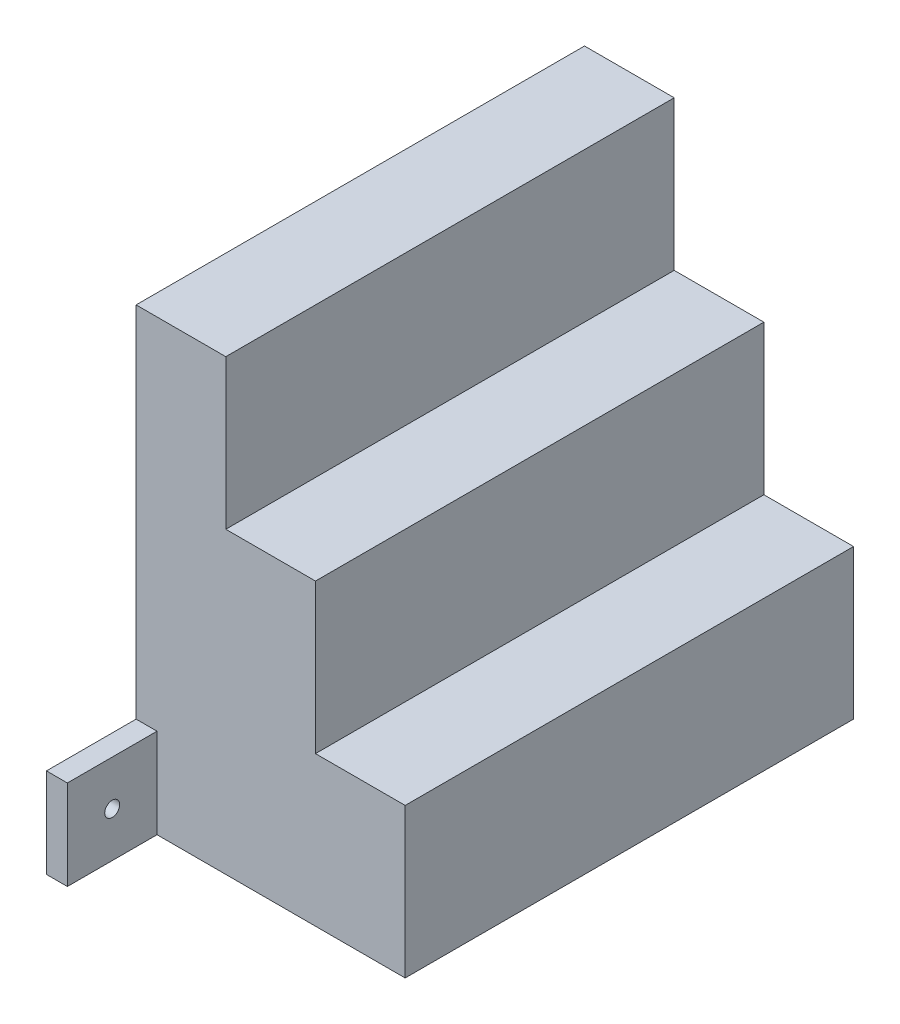
ISO-10303-21;
HEADER;
FILE_DESCRIPTION(('STEP AP214'),'2;1');
FILE_NAME('part.step','',(''),(''),'','','');
FILE_SCHEMA(('AUTOMOTIVE_DESIGN { 1 0 10303 214 1 1 1 1 }'));
ENDSEC;
DATA;
#1=APPLICATION_CONTEXT('core data for automotive mechanical design processes');
#2=APPLICATION_PROTOCOL_DEFINITION('international standard','automotive_design',2000,#1);
#3=PRODUCT_CONTEXT('',#1,'mechanical');
#4=PRODUCT('Part','Part','',(#3));
#5=PRODUCT_RELATED_PRODUCT_CATEGORY('part','',(#4));
#6=PRODUCT_DEFINITION_FORMATION('','',#4);
#7=PRODUCT_DEFINITION_CONTEXT('part definition',#1,'design');
#8=PRODUCT_DEFINITION('design','',#6,#7);
#9=PRODUCT_DEFINITION_SHAPE('','',#8);
#10=(LENGTH_UNIT() NAMED_UNIT(*) SI_UNIT(.MILLI.,.METRE.));
#11=(NAMED_UNIT(*) PLANE_ANGLE_UNIT() SI_UNIT($,.RADIAN.));
#12=(NAMED_UNIT(*) SI_UNIT($,.STERADIAN.) SOLID_ANGLE_UNIT());
#13=UNCERTAINTY_MEASURE_WITH_UNIT(LENGTH_MEASURE(1.E-05),#10,'distance_accuracy_value','');
#14=(GEOMETRIC_REPRESENTATION_CONTEXT(3) GLOBAL_UNCERTAINTY_ASSIGNED_CONTEXT((#13)) GLOBAL_UNIT_ASSIGNED_CONTEXT((#10,
#11,#12)) REPRESENTATION_CONTEXT('',''));
#15=CARTESIAN_POINT('',(0.,0.,0.));
#16=DIRECTION('',(0.,0.,1.));
#17=DIRECTION('',(1.,0.,0.));
#18=AXIS2_PLACEMENT_3D('',#15,#16,#17);
#19=CARTESIAN_POINT('',(0.,0.,-190.5));
#20=DIRECTION('',(0.,0.,-1.));
#21=DIRECTION('',(-1.,0.,0.));
#22=AXIS2_PLACEMENT_3D('',#19,#20,#21);
#23=PLANE('',#22);
#24=DIRECTION('',(1.,0.,0.));
#25=VECTOR('',#24,1.);
#26=CARTESIAN_POINT('',(228.6,0.,-190.5));
#27=LINE('',#26,#25);
#28=CARTESIAN_POINT('',(17.78,0.,-190.5));
#29=VERTEX_POINT('',#28);
#30=CARTESIAN_POINT('',(228.6,0.,-190.5));
#31=VERTEX_POINT('',#30);
#32=EDGE_CURVE('E240',#29,#31,#27,.T.);
#33=ORIENTED_EDGE('',*,*,#32,.F.);
#34=DIRECTION('',(0.,1.,0.));
#35=VECTOR('',#34,1.);
#36=CARTESIAN_POINT('',(17.78,0.,-190.5));
#37=LINE('',#36,#35);
#38=CARTESIAN_POINT('',(17.78,76.2,-190.5));
#39=VERTEX_POINT('',#38);
#40=EDGE_CURVE('E193',#29,#39,#37,.T.);
#41=ORIENTED_EDGE('',*,*,#40,.T.);
#42=DIRECTION('',(-1.,0.,0.));
#43=VECTOR('',#42,1.);
#44=CARTESIAN_POINT('',(17.78,76.2,-190.5));
#45=LINE('',#44,#43);
#46=CARTESIAN_POINT('',(0.,76.2,-190.5));
#47=VERTEX_POINT('',#46);
#48=EDGE_CURVE('E165',#39,#47,#45,.T.);
#49=ORIENTED_EDGE('',*,*,#48,.T.);
#50=DIRECTION('',(0.,-1.,0.));
#51=VECTOR('',#50,1.);
#52=CARTESIAN_POINT('',(0.,0.,-190.5));
#53=LINE('',#52,#51);
#54=CARTESIAN_POINT('',(0.,381.,-190.5));
#55=VERTEX_POINT('',#54);
#56=EDGE_CURVE('E181',#55,#47,#53,.T.);
#57=ORIENTED_EDGE('',*,*,#56,.F.);
#58=DIRECTION('',(-1.,0.,0.));
#59=VECTOR('',#58,1.);
#60=CARTESIAN_POINT('',(0.,381.,-190.5));
#61=LINE('',#60,#59);
#62=CARTESIAN_POINT('',(76.1999999999999,381.,-190.5));
#63=VERTEX_POINT('',#62);
#64=EDGE_CURVE('E290',#63,#55,#61,.T.);
#65=ORIENTED_EDGE('',*,*,#64,.F.);
#66=DIRECTION('',(0.,1.,0.));
#67=VECTOR('',#66,1.);
#68=CARTESIAN_POINT('',(76.1999999999999,381.,-190.5));
#69=LINE('',#68,#67);
#70=CARTESIAN_POINT('',(76.2,254.,-190.5));
#71=VERTEX_POINT('',#70);
#72=EDGE_CURVE('E287',#71,#63,#69,.T.);
#73=ORIENTED_EDGE('',*,*,#72,.F.);
#74=DIRECTION('',(-1.,0.,0.));
#75=VECTOR('',#74,1.);
#76=CARTESIAN_POINT('',(76.2,254.,-190.5));
#77=LINE('',#76,#75);
#78=CARTESIAN_POINT('',(152.4,254.,-190.5));
#79=VERTEX_POINT('',#78);
#80=EDGE_CURVE('E284',#79,#71,#77,.T.);
#81=ORIENTED_EDGE('',*,*,#80,.F.);
#82=DIRECTION('',(0.,1.,0.));
#83=VECTOR('',#82,1.);
#84=CARTESIAN_POINT('',(152.4,254.,-190.5));
#85=LINE('',#84,#83);
#86=CARTESIAN_POINT('',(152.4,127.,-190.5));
#87=VERTEX_POINT('',#86);
#88=EDGE_CURVE('E281',#87,#79,#85,.T.);
#89=ORIENTED_EDGE('',*,*,#88,.F.);
#90=DIRECTION('',(-1.,0.,0.));
#91=VECTOR('',#90,1.);
#92=CARTESIAN_POINT('',(152.4,127.,-190.5));
#93=LINE('',#92,#91);
#94=CARTESIAN_POINT('',(228.6,127.,-190.5));
#95=VERTEX_POINT('',#94);
#96=EDGE_CURVE('E278',#95,#87,#93,.T.);
#97=ORIENTED_EDGE('',*,*,#96,.F.);
#98=DIRECTION('',(0.,1.,0.));
#99=VECTOR('',#98,1.);
#100=CARTESIAN_POINT('',(228.6,127.,-190.5));
#101=LINE('',#100,#99);
#102=EDGE_CURVE('E275',#31,#95,#101,.T.);
#103=ORIENTED_EDGE('',*,*,#102,.F.);
#104=EDGE_LOOP('',(#33,#41,#49,#57,#65,#73,#81,#89,#97,#103));
#105=FACE_BOUND('',#104,.T.);
#106=ADVANCED_FACE('F55',(#105),#23,.T.);
#107=CARTESIAN_POINT('',(0.,0.,190.5));
#108=DIRECTION('',(0.,0.,-1.));
#109=DIRECTION('',(-1.,0.,0.));
#110=AXIS2_PLACEMENT_3D('',#107,#108,#109);
#111=PLANE('',#110);
#112=DIRECTION('',(-1.,0.,0.));
#113=VECTOR('',#112,1.);
#114=CARTESIAN_POINT('',(17.78,76.2,190.5));
#115=LINE('',#114,#113);
#116=CARTESIAN_POINT('',(17.78,76.2,190.5));
#117=VERTEX_POINT('',#116);
#118=CARTESIAN_POINT('',(0.,76.2,190.5));
#119=VERTEX_POINT('',#118);
#120=EDGE_CURVE('E237',#117,#119,#115,.T.);
#121=ORIENTED_EDGE('',*,*,#120,.F.);
#122=DIRECTION('',(0.,-1.,0.));
#123=VECTOR('',#122,1.);
#124=CARTESIAN_POINT('',(17.78,0.,190.5));
#125=LINE('',#124,#123);
#126=CARTESIAN_POINT('',(17.78,0.,190.5));
#127=VERTEX_POINT('',#126);
#128=EDGE_CURVE('E216',#117,#127,#125,.T.);
#129=ORIENTED_EDGE('',*,*,#128,.T.);
#130=DIRECTION('',(1.,0.,0.));
#131=VECTOR('',#130,1.);
#132=CARTESIAN_POINT('',(228.6,0.,190.5));
#133=LINE('',#132,#131);
#134=CARTESIAN_POINT('',(228.6,0.,190.5));
#135=VERTEX_POINT('',#134);
#136=EDGE_CURVE('E247',#127,#135,#133,.T.);
#137=ORIENTED_EDGE('',*,*,#136,.T.);
#138=DIRECTION('',(0.,1.,0.));
#139=VECTOR('',#138,1.);
#140=CARTESIAN_POINT('',(228.6,127.,190.5));
#141=LINE('',#140,#139);
#142=CARTESIAN_POINT('',(228.6,127.,190.5));
#143=VERTEX_POINT('',#142);
#144=EDGE_CURVE('E250',#135,#143,#141,.T.);
#145=ORIENTED_EDGE('',*,*,#144,.T.);
#146=DIRECTION('',(-1.,0.,0.));
#147=VECTOR('',#146,1.);
#148=CARTESIAN_POINT('',(152.4,127.,190.5));
#149=LINE('',#148,#147);
#150=CARTESIAN_POINT('',(152.4,127.,190.5));
#151=VERTEX_POINT('',#150);
#152=EDGE_CURVE('E253',#143,#151,#149,.T.);
#153=ORIENTED_EDGE('',*,*,#152,.T.);
#154=DIRECTION('',(0.,1.,0.));
#155=VECTOR('',#154,1.);
#156=CARTESIAN_POINT('',(152.4,254.,190.5));
#157=LINE('',#156,#155);
#158=CARTESIAN_POINT('',(152.4,254.,190.5));
#159=VERTEX_POINT('',#158);
#160=EDGE_CURVE('E256',#151,#159,#157,.T.);
#161=ORIENTED_EDGE('',*,*,#160,.T.);
#162=DIRECTION('',(-1.,0.,0.));
#163=VECTOR('',#162,1.);
#164=CARTESIAN_POINT('',(76.2,254.,190.5));
#165=LINE('',#164,#163);
#166=CARTESIAN_POINT('',(76.2,254.,190.5));
#167=VERTEX_POINT('',#166);
#168=EDGE_CURVE('E259',#159,#167,#165,.T.);
#169=ORIENTED_EDGE('',*,*,#168,.T.);
#170=DIRECTION('',(0.,1.,0.));
#171=VECTOR('',#170,1.);
#172=CARTESIAN_POINT('',(76.1999999999999,381.,190.5));
#173=LINE('',#172,#171);
#174=CARTESIAN_POINT('',(76.1999999999999,381.,190.5));
#175=VERTEX_POINT('',#174);
#176=EDGE_CURVE('E262',#167,#175,#173,.T.);
#177=ORIENTED_EDGE('',*,*,#176,.T.);
#178=DIRECTION('',(-1.,0.,0.));
#179=VECTOR('',#178,1.);
#180=CARTESIAN_POINT('',(0.,381.,190.5));
#181=LINE('',#180,#179);
#182=CARTESIAN_POINT('',(0.,381.,190.5));
#183=VERTEX_POINT('',#182);
#184=EDGE_CURVE('E265',#175,#183,#181,.T.);
#185=ORIENTED_EDGE('',*,*,#184,.T.);
#186=DIRECTION('',(0.,-1.,0.));
#187=VECTOR('',#186,1.);
#188=CARTESIAN_POINT('',(0.,0.,190.5));
#189=LINE('',#188,#187);
#190=EDGE_CURVE('E268',#183,#119,#189,.T.);
#191=ORIENTED_EDGE('',*,*,#190,.T.);
#192=EDGE_LOOP('',(#121,#129,#137,#145,#153,#161,#169,#177,#185,#191));
#193=FACE_BOUND('',#192,.T.);
#194=ADVANCED_FACE('F343',(#193),#111,.F.);
#195=CARTESIAN_POINT('',(228.6,0.,190.5));
#196=DIRECTION('',(0.,1.,0.));
#197=DIRECTION('',(-1.,0.,0.));
#198=AXIS2_PLACEMENT_3D('',#195,#196,#197);
#199=PLANE('',#198);
#200=DIRECTION('',(0.,0.,-1.));
#201=VECTOR('',#200,1.);
#202=CARTESIAN_POINT('',(0.,0.,190.5));
#203=LINE('',#202,#201);
#204=CARTESIAN_POINT('',(0.,0.,266.7));
#205=VERTEX_POINT('',#204);
#206=CARTESIAN_POINT('',(0.,0.,-266.7));
#207=VERTEX_POINT('',#206);
#208=EDGE_CURVE('E272',#205,#207,#203,.T.);
#209=ORIENTED_EDGE('',*,*,#208,.T.);
#210=DIRECTION('',(-1.,0.,0.));
#211=VECTOR('',#210,1.);
#212=CARTESIAN_POINT('',(17.78,0.,-266.7));
#213=LINE('',#212,#211);
#214=CARTESIAN_POINT('',(17.78,0.,-266.7));
#215=VERTEX_POINT('',#214);
#216=EDGE_CURVE('E171',#215,#207,#213,.T.);
#217=ORIENTED_EDGE('',*,*,#216,.F.);
#218=DIRECTION('',(0.,0.,1.));
#219=VECTOR('',#218,1.);
#220=CARTESIAN_POINT('',(17.78,0.,-266.7));
#221=LINE('',#220,#219);
#222=EDGE_CURVE('E187',#215,#29,#221,.T.);
#223=ORIENTED_EDGE('',*,*,#222,.T.);
#224=ORIENTED_EDGE('',*,*,#32,.T.);
#225=DIRECTION('',(0.,0.,-1.));
#226=VECTOR('',#225,1.);
#227=CARTESIAN_POINT('',(228.6,0.,190.5));
#228=LINE('',#227,#226);
#229=EDGE_CURVE('E13',#135,#31,#228,.T.);
#230=ORIENTED_EDGE('',*,*,#229,.F.);
#231=ORIENTED_EDGE('',*,*,#136,.F.);
#232=DIRECTION('',(0.,0.,1.));
#233=VECTOR('',#232,1.);
#234=CARTESIAN_POINT('',(17.78,0.,190.5));
#235=LINE('',#234,#233);
#236=CARTESIAN_POINT('',(17.78,0.,266.7));
#237=VERTEX_POINT('',#236);
#238=EDGE_CURVE('E79',#127,#237,#235,.T.);
#239=ORIENTED_EDGE('',*,*,#238,.T.);
#240=DIRECTION('',(-1.,0.,0.));
#241=VECTOR('',#240,1.);
#242=CARTESIAN_POINT('',(17.78,0.,266.7));
#243=LINE('',#242,#241);
#244=EDGE_CURVE('E230',#237,#205,#243,.T.);
#245=ORIENTED_EDGE('',*,*,#244,.T.);
#246=EDGE_LOOP('',(#209,#217,#223,#224,#230,#231,#239,#245));
#247=FACE_BOUND('',#246,.T.);
#248=ADVANCED_FACE('F57',(#247),#199,.F.);
#249=CARTESIAN_POINT('',(228.6,127.,190.5));
#250=DIRECTION('',(-1.,0.,0.));
#251=DIRECTION('',(0.,-1.,0.));
#252=AXIS2_PLACEMENT_3D('',#249,#250,#251);
#253=PLANE('',#252);
#254=ORIENTED_EDGE('',*,*,#102,.T.);
#255=DIRECTION('',(0.,0.,-1.));
#256=VECTOR('',#255,1.);
#257=CARTESIAN_POINT('',(228.6,127.,190.5));
#258=LINE('',#257,#256);
#259=EDGE_CURVE('E64',#143,#95,#258,.T.);
#260=ORIENTED_EDGE('',*,*,#259,.F.);
#261=ORIENTED_EDGE('',*,*,#144,.F.);
#262=ORIENTED_EDGE('',*,*,#229,.T.);
#263=EDGE_LOOP('',(#254,#260,#261,#262));
#264=FACE_BOUND('',#263,.T.);
#265=ADVANCED_FACE('F347',(#264),#253,.F.);
#266=CARTESIAN_POINT('',(152.4,127.,190.5));
#267=DIRECTION('',(0.,-1.,0.));
#268=DIRECTION('',(0.,0.,-1.));
#269=AXIS2_PLACEMENT_3D('',#266,#267,#268);
#270=PLANE('',#269);
#271=ORIENTED_EDGE('',*,*,#96,.T.);
#272=DIRECTION('',(0.,0.,-1.));
#273=VECTOR('',#272,1.);
#274=CARTESIAN_POINT('',(152.4,127.,190.5));
#275=LINE('',#274,#273);
#276=EDGE_CURVE('E312',#151,#87,#275,.T.);
#277=ORIENTED_EDGE('',*,*,#276,.F.);
#278=ORIENTED_EDGE('',*,*,#152,.F.);
#279=ORIENTED_EDGE('',*,*,#259,.T.);
#280=EDGE_LOOP('',(#271,#277,#278,#279));
#281=FACE_BOUND('',#280,.T.);
#282=ADVANCED_FACE('F322',(#281),#270,.F.);
#283=CARTESIAN_POINT('',(152.4,254.,190.5));
#284=DIRECTION('',(-1.,0.,0.));
#285=DIRECTION('',(0.,-1.,0.));
#286=AXIS2_PLACEMENT_3D('',#283,#284,#285);
#287=PLANE('',#286);
#288=ORIENTED_EDGE('',*,*,#88,.T.);
#289=DIRECTION('',(0.,0.,-1.));
#290=VECTOR('',#289,1.);
#291=CARTESIAN_POINT('',(152.4,254.,190.5));
#292=LINE('',#291,#290);
#293=EDGE_CURVE('E308',#159,#79,#292,.T.);
#294=ORIENTED_EDGE('',*,*,#293,.F.);
#295=ORIENTED_EDGE('',*,*,#160,.F.);
#296=ORIENTED_EDGE('',*,*,#276,.T.);
#297=EDGE_LOOP('',(#288,#294,#295,#296));
#298=FACE_BOUND('',#297,.T.);
#299=ADVANCED_FACE('F334',(#298),#287,.F.);
#300=CARTESIAN_POINT('',(76.2,254.,190.5));
#301=DIRECTION('',(0.,-1.,0.));
#302=DIRECTION('',(0.,0.,-1.));
#303=AXIS2_PLACEMENT_3D('',#300,#301,#302);
#304=PLANE('',#303);
#305=ORIENTED_EDGE('',*,*,#80,.T.);
#306=DIRECTION('',(0.,0.,-1.));
#307=VECTOR('',#306,1.);
#308=CARTESIAN_POINT('',(76.2,254.,190.5));
#309=LINE('',#308,#307);
#310=EDGE_CURVE('E304',#167,#71,#309,.T.);
#311=ORIENTED_EDGE('',*,*,#310,.F.);
#312=ORIENTED_EDGE('',*,*,#168,.F.);
#313=ORIENTED_EDGE('',*,*,#293,.T.);
#314=EDGE_LOOP('',(#305,#311,#312,#313));
#315=FACE_BOUND('',#314,.T.);
#316=ADVANCED_FACE('F338',(#315),#304,.F.);
#317=CARTESIAN_POINT('',(76.1999999999999,381.,190.5));
#318=DIRECTION('',(-1.,0.,0.));
#319=DIRECTION('',(0.,-1.,0.));
#320=AXIS2_PLACEMENT_3D('',#317,#318,#319);
#321=PLANE('',#320);
#322=ORIENTED_EDGE('',*,*,#72,.T.);
#323=DIRECTION('',(0.,0.,-1.));
#324=VECTOR('',#323,1.);
#325=CARTESIAN_POINT('',(76.1999999999999,381.,190.5));
#326=LINE('',#325,#324);
#327=EDGE_CURVE('E300',#175,#63,#326,.T.);
#328=ORIENTED_EDGE('',*,*,#327,.F.);
#329=ORIENTED_EDGE('',*,*,#176,.F.);
#330=ORIENTED_EDGE('',*,*,#310,.T.);
#331=EDGE_LOOP('',(#322,#328,#329,#330));
#332=FACE_BOUND('',#331,.T.);
#333=ADVANCED_FACE('F377',(#332),#321,.F.);
#334=CARTESIAN_POINT('',(0.,381.,190.5));
#335=DIRECTION('',(0.,-1.,0.));
#336=DIRECTION('',(0.,0.,-1.));
#337=AXIS2_PLACEMENT_3D('',#334,#335,#336);
#338=PLANE('',#337);
#339=ORIENTED_EDGE('',*,*,#64,.T.);
#340=DIRECTION('',(0.,0.,-1.));
#341=VECTOR('',#340,1.);
#342=CARTESIAN_POINT('',(0.,381.,190.5));
#343=LINE('',#342,#341);
#344=EDGE_CURVE('E297',#183,#55,#343,.T.);
#345=ORIENTED_EDGE('',*,*,#344,.F.);
#346=ORIENTED_EDGE('',*,*,#184,.F.);
#347=ORIENTED_EDGE('',*,*,#327,.T.);
#348=EDGE_LOOP('',(#339,#345,#346,#347));
#349=FACE_BOUND('',#348,.T.);
#350=ADVANCED_FACE('F375',(#349),#338,.F.);
#351=CARTESIAN_POINT('',(0.,0.,190.5));
#352=DIRECTION('',(1.,0.,0.));
#353=DIRECTION('',(0.,1.,0.));
#354=AXIS2_PLACEMENT_3D('',#351,#352,#353);
#355=PLANE('',#354);
#356=ORIENTED_EDGE('',*,*,#56,.T.);
#357=DIRECTION('',(0.,0.,-1.));
#358=VECTOR('',#357,1.);
#359=CARTESIAN_POINT('',(0.,76.2,-266.7));
#360=LINE('',#359,#358);
#361=CARTESIAN_POINT('',(0.,76.2,-266.7));
#362=VERTEX_POINT('',#361);
#363=EDGE_CURVE('E71',#47,#362,#360,.T.);
#364=ORIENTED_EDGE('',*,*,#363,.T.);
#365=DIRECTION('',(0.,-1.,0.));
#366=VECTOR('',#365,1.);
#367=CARTESIAN_POINT('',(0.,0.,-266.7));
#368=LINE('',#367,#366);
#369=EDGE_CURVE('E169',#362,#207,#368,.T.);
#370=ORIENTED_EDGE('',*,*,#369,.T.);
#371=ORIENTED_EDGE('',*,*,#208,.F.);
#372=DIRECTION('',(0.,1.,0.));
#373=VECTOR('',#372,1.);
#374=CARTESIAN_POINT('',(0.,0.,266.7));
#375=LINE('',#374,#373);
#376=CARTESIAN_POINT('',(0.,76.2,266.7));
#377=VERTEX_POINT('',#376);
#378=EDGE_CURVE('E212',#205,#377,#375,.T.);
#379=ORIENTED_EDGE('',*,*,#378,.T.);
#380=DIRECTION('',(0.,0.,-1.));
#381=VECTOR('',#380,1.);
#382=CARTESIAN_POINT('',(0.,76.2,190.5));
#383=LINE('',#382,#381);
#384=EDGE_CURVE('E219',#377,#119,#383,.T.);
#385=ORIENTED_EDGE('',*,*,#384,.T.);
#386=ORIENTED_EDGE('',*,*,#190,.F.);
#387=ORIENTED_EDGE('',*,*,#344,.T.);
#388=EDGE_LOOP('',(#356,#364,#370,#371,#379,#385,#386,#387));
#389=FACE_BOUND('',#388,.T.);
#390=CARTESIAN_POINT('',(0.,38.1,228.6));
#391=DIRECTION('',(-1.,0.,0.));
#392=DIRECTION('',(0.,0.,1.));
#393=AXIS2_PLACEMENT_3D('',#390,#391,#392);
#394=CIRCLE('',#393,6.35);
#395=CARTESIAN_POINT('',(0.,38.1,234.95));
#396=VERTEX_POINT('',#395);
#397=EDGE_CURVE('E204',#396,#396,#394,.T.);
#398=ORIENTED_EDGE('',*,*,#397,.F.);
#399=EDGE_LOOP('',(#398));
#400=FACE_BOUND('',#399,.T.);
#401=CARTESIAN_POINT('',(0.,38.1,-228.6));
#402=DIRECTION('',(-1.,0.,0.));
#403=DIRECTION('',(0.,0.,1.));
#404=AXIS2_PLACEMENT_3D('',#401,#402,#403);
#405=CIRCLE('',#404,6.35);
#406=CARTESIAN_POINT('',(0.,38.1,-222.25));
#407=VERTEX_POINT('',#406);
#408=EDGE_CURVE('E200',#407,#407,#405,.T.);
#409=ORIENTED_EDGE('',*,*,#408,.F.);
#410=EDGE_LOOP('',(#409));
#411=FACE_BOUND('',#410,.T.);
#412=ADVANCED_FACE('F177',(#389,#400,#411),#355,.F.);
#413=CARTESIAN_POINT('',(17.78,76.2,190.5));
#414=DIRECTION('',(0.,1.,0.));
#415=DIRECTION('',(0.,0.,1.));
#416=AXIS2_PLACEMENT_3D('',#413,#414,#415);
#417=PLANE('',#416);
#418=ORIENTED_EDGE('',*,*,#384,.F.);
#419=DIRECTION('',(-1.,0.,0.));
#420=VECTOR('',#419,1.);
#421=CARTESIAN_POINT('',(17.78,76.2,266.7));
#422=LINE('',#421,#420);
#423=CARTESIAN_POINT('',(17.78,76.2,266.7));
#424=VERTEX_POINT('',#423);
#425=EDGE_CURVE('E241',#424,#377,#422,.T.);
#426=ORIENTED_EDGE('',*,*,#425,.F.);
#427=DIRECTION('',(0.,0.,-1.));
#428=VECTOR('',#427,1.);
#429=CARTESIAN_POINT('',(17.78,76.2,190.5));
#430=LINE('',#429,#428);
#431=EDGE_CURVE('E226',#424,#117,#430,.T.);
#432=ORIENTED_EDGE('',*,*,#431,.T.);
#433=ORIENTED_EDGE('',*,*,#120,.T.);
#434=EDGE_LOOP('',(#418,#426,#432,#433));
#435=FACE_BOUND('',#434,.T.);
#436=ADVANCED_FACE('F374',(#435),#417,.T.);
#437=CARTESIAN_POINT('',(17.78,0.,266.7));
#438=DIRECTION('',(0.,0.,1.));
#439=DIRECTION('',(1.,0.,0.));
#440=AXIS2_PLACEMENT_3D('',#437,#438,#439);
#441=PLANE('',#440);
#442=ORIENTED_EDGE('',*,*,#378,.F.);
#443=ORIENTED_EDGE('',*,*,#244,.F.);
#444=DIRECTION('',(0.,1.,0.));
#445=VECTOR('',#444,1.);
#446=CARTESIAN_POINT('',(17.78,0.,266.7));
#447=LINE('',#446,#445);
#448=EDGE_CURVE('E222',#237,#424,#447,.T.);
#449=ORIENTED_EDGE('',*,*,#448,.T.);
#450=ORIENTED_EDGE('',*,*,#425,.T.);
#451=EDGE_LOOP('',(#442,#443,#449,#450));
#452=FACE_BOUND('',#451,.T.);
#453=ADVANCED_FACE('F407',(#452),#441,.T.);
#454=CARTESIAN_POINT('',(17.78,0.,0.));
#455=DIRECTION('',(1.,0.,0.));
#456=DIRECTION('',(0.,0.,-1.));
#457=AXIS2_PLACEMENT_3D('',#454,#455,#456);
#458=PLANE('',#457);
#459=CARTESIAN_POINT('',(17.78,38.1,228.6));
#460=DIRECTION('',(-1.,0.,0.));
#461=DIRECTION('',(0.,0.,1.));
#462=AXIS2_PLACEMENT_3D('',#459,#460,#461);
#463=CIRCLE('',#462,6.35);
#464=CARTESIAN_POINT('',(17.78,38.1,234.95));
#465=VERTEX_POINT('',#464);
#466=EDGE_CURVE('E208',#465,#465,#463,.T.);
#467=ORIENTED_EDGE('',*,*,#466,.T.);
#468=EDGE_LOOP('',(#467));
#469=FACE_BOUND('',#468,.T.);
#470=ORIENTED_EDGE('',*,*,#128,.F.);
#471=ORIENTED_EDGE('',*,*,#431,.F.);
#472=ORIENTED_EDGE('',*,*,#448,.F.);
#473=ORIENTED_EDGE('',*,*,#238,.F.);
#474=EDGE_LOOP('',(#470,#471,#472,#473));
#475=FACE_BOUND('',#474,.T.);
#476=ADVANCED_FACE('F416',(#469,#475),#458,.T.);
#477=CARTESIAN_POINT('',(17.78,38.1,228.6));
#478=DIRECTION('',(-1.,0.,0.));
#479=DIRECTION('',(0.,0.,1.));
#480=AXIS2_PLACEMENT_3D('',#477,#478,#479);
#481=CYLINDRICAL_SURFACE('',#480,6.35);
#482=CARTESIAN_POINT('',(17.78,38.1,234.95));
#483=CARTESIAN_POINT('',(17.5947916666667,38.1,234.95));
#484=CARTESIAN_POINT('',(17.4095833333333,38.1,234.95));
#485=CARTESIAN_POINT('',(17.0391666666667,38.1,234.95));
#486=CARTESIAN_POINT('',(16.8539583333333,38.1,234.95));
#487=CARTESIAN_POINT('',(16.4835416666667,38.1,234.95));
#488=CARTESIAN_POINT('',(16.2983333333333,38.1,234.95));
#489=CARTESIAN_POINT('',(15.9279166666667,38.1,234.95));
#490=CARTESIAN_POINT('',(15.7427083333333,38.1,234.95));
#491=CARTESIAN_POINT('',(15.3722916666667,38.1,234.95));
#492=CARTESIAN_POINT('',(15.1870833333333,38.1,234.95));
#493=CARTESIAN_POINT('',(14.8166666666667,38.1,234.95));
#494=CARTESIAN_POINT('',(14.6314583333333,38.1,234.95));
#495=CARTESIAN_POINT('',(14.2610416666667,38.1,234.95));
#496=CARTESIAN_POINT('',(14.0758333333333,38.1,234.95));
#497=CARTESIAN_POINT('',(13.7054166666667,38.1,234.95));
#498=CARTESIAN_POINT('',(13.5202083333333,38.1,234.95));
#499=CARTESIAN_POINT('',(13.1497916666667,38.1,234.95));
#500=CARTESIAN_POINT('',(12.9645833333333,38.1,234.95));
#501=CARTESIAN_POINT('',(12.5941666666667,38.1,234.95));
#502=CARTESIAN_POINT('',(12.4089583333333,38.1,234.95));
#503=CARTESIAN_POINT('',(12.0385416666667,38.1,234.95));
#504=CARTESIAN_POINT('',(11.8533333333333,38.1,234.95));
#505=CARTESIAN_POINT('',(11.4829166666667,38.1,234.95));
#506=CARTESIAN_POINT('',(11.2977083333333,38.1,234.95));
#507=CARTESIAN_POINT('',(10.9272916666667,38.1,234.95));
#508=CARTESIAN_POINT('',(10.7420833333333,38.1,234.95));
#509=CARTESIAN_POINT('',(10.3716666666667,38.1,234.95));
#510=CARTESIAN_POINT('',(10.1864583333333,38.1,234.95));
#511=CARTESIAN_POINT('',(9.81604166666667,38.1,234.95));
#512=CARTESIAN_POINT('',(9.63083333333334,38.1,234.95));
#513=CARTESIAN_POINT('',(9.26041666666667,38.1,234.95));
#514=CARTESIAN_POINT('',(9.07520833333334,38.1,234.95));
#515=CARTESIAN_POINT('',(8.70479166666667,38.1,234.95));
#516=CARTESIAN_POINT('',(8.51958333333334,38.1,234.95));
#517=CARTESIAN_POINT('',(8.14916666666667,38.1,234.95));
#518=CARTESIAN_POINT('',(7.96395833333334,38.1,234.95));
#519=CARTESIAN_POINT('',(7.59354166666667,38.1,234.95));
#520=CARTESIAN_POINT('',(7.40833333333333,38.1,234.95));
#521=CARTESIAN_POINT('',(7.03791666666667,38.1,234.95));
#522=CARTESIAN_POINT('',(6.85270833333333,38.1,234.95));
#523=CARTESIAN_POINT('',(6.48229166666667,38.1,234.95));
#524=CARTESIAN_POINT('',(6.29708333333333,38.1,234.95));
#525=CARTESIAN_POINT('',(5.92666666666667,38.1,234.95));
#526=CARTESIAN_POINT('',(5.74145833333334,38.1,234.95));
#527=CARTESIAN_POINT('',(5.37104166666667,38.1,234.95));
#528=CARTESIAN_POINT('',(5.18583333333333,38.1,234.95));
#529=CARTESIAN_POINT('',(4.81541666666667,38.1,234.95));
#530=CARTESIAN_POINT('',(4.63020833333333,38.1,234.95));
#531=CARTESIAN_POINT('',(4.25979166666667,38.1,234.95));
#532=CARTESIAN_POINT('',(4.07458333333333,38.1,234.95));
#533=CARTESIAN_POINT('',(3.70416666666667,38.1,234.95));
#534=CARTESIAN_POINT('',(3.51895833333333,38.1,234.95));
#535=CARTESIAN_POINT('',(3.14854166666667,38.1,234.95));
#536=CARTESIAN_POINT('',(2.96333333333333,38.1,234.95));
#537=CARTESIAN_POINT('',(2.59291666666667,38.1,234.95));
#538=CARTESIAN_POINT('',(2.40770833333333,38.1,234.95));
#539=CARTESIAN_POINT('',(2.03729166666667,38.1,234.95));
#540=CARTESIAN_POINT('',(1.85208333333333,38.1,234.95));
#541=CARTESIAN_POINT('',(1.48166666666667,38.1,234.95));
#542=CARTESIAN_POINT('',(1.29645833333333,38.1,234.95));
#543=CARTESIAN_POINT('',(0.926041666666668,38.1,234.95));
#544=CARTESIAN_POINT('',(0.740833333333334,38.1,234.95));
#545=CARTESIAN_POINT('',(0.370416666666667,38.1,234.95));
#546=CARTESIAN_POINT('',(0.185208333333334,38.1,234.95));
#547=CARTESIAN_POINT('',(0.,38.1,234.95));
#548=B_SPLINE_CURVE_WITH_KNOTS('',3,(#482,#483,#484,#485,#486,#487,#488,#489,#490,#491,#492,
#493,#494,#495,#496,#497,#498,#499,#500,#501,#502,#503,#504,#505,#506,#507,#508,#509,#510,#511,
#512,#513,#514,#515,#516,#517,#518,#519,#520,#521,#522,#523,#524,#525,#526,#527,#528,#529,#530,
#531,#532,#533,#534,#535,#536,#537,#538,#539,#540,#541,#542,#543,#544,#545,#546,#547),
.UNSPECIFIED.,.F.,.F.,(4,2,2,2,2,2,2,2,2,2,2,2,2,2,2,2,2,2,2,2,2,2,2,2,2,2,2,2,2,2,2,2,4),(0.,
0.555624999999997,1.11125,1.666875,2.2225,2.778125,3.33375,3.889375,4.445,5.000625,5.55625,
6.111875,6.6675,7.223125,7.77875,8.334375,8.89,9.445625,10.00125,10.556875,11.1125,11.668125,
12.22375,12.779375,13.335,13.890625,14.44625,15.001875,15.5575,16.113125,16.66875,17.224375,
17.78),.UNSPECIFIED.);
#549=EDGE_CURVE('BSEAM424',#465,#396,#548,.T.);
#550=ORIENTED_EDGE('',*,*,#466,.F.);
#551=ORIENTED_EDGE('',*,*,#397,.T.);
#552=ORIENTED_EDGE('',*,*,#549,.T.);
#553=ORIENTED_EDGE('',*,*,#549,.F.);
#554=EDGE_LOOP('',(#550,#552,#551,#553));
#555=FACE_BOUND('',#554,.T.);
#556=ADVANCED_FACE('F424',(#555),#481,.F.);
#557=CARTESIAN_POINT('',(17.78,0.,-266.7));
#558=DIRECTION('',(0.,0.,-1.));
#559=DIRECTION('',(-1.,0.,0.));
#560=AXIS2_PLACEMENT_3D('',#557,#558,#559);
#561=PLANE('',#560);
#562=ORIENTED_EDGE('',*,*,#369,.F.);
#563=DIRECTION('',(-1.,0.,0.));
#564=VECTOR('',#563,1.);
#565=CARTESIAN_POINT('',(17.78,76.2,-266.7));
#566=LINE('',#565,#564);
#567=CARTESIAN_POINT('',(17.78,76.2,-266.7));
#568=VERTEX_POINT('',#567);
#569=EDGE_CURVE('E156',#568,#362,#566,.T.);
#570=ORIENTED_EDGE('',*,*,#569,.F.);
#571=DIRECTION('',(0.,-1.,0.));
#572=VECTOR('',#571,1.);
#573=CARTESIAN_POINT('',(17.78,0.,-266.7));
#574=LINE('',#573,#572);
#575=EDGE_CURVE('E183',#568,#215,#574,.T.);
#576=ORIENTED_EDGE('',*,*,#575,.T.);
#577=ORIENTED_EDGE('',*,*,#216,.T.);
#578=EDGE_LOOP('',(#562,#570,#576,#577));
#579=FACE_BOUND('',#578,.T.);
#580=ADVANCED_FACE('F170',(#579),#561,.T.);
#581=CARTESIAN_POINT('',(17.78,76.2,-266.7));
#582=DIRECTION('',(0.,1.,0.));
#583=DIRECTION('',(0.,0.,1.));
#584=AXIS2_PLACEMENT_3D('',#581,#582,#583);
#585=PLANE('',#584);
#586=ORIENTED_EDGE('',*,*,#363,.F.);
#587=ORIENTED_EDGE('',*,*,#48,.F.);
#588=DIRECTION('',(0.,0.,-1.));
#589=VECTOR('',#588,1.);
#590=CARTESIAN_POINT('',(17.78,76.2,-266.7));
#591=LINE('',#590,#589);
#592=EDGE_CURVE('E160',#39,#568,#591,.T.);
#593=ORIENTED_EDGE('',*,*,#592,.T.);
#594=ORIENTED_EDGE('',*,*,#569,.T.);
#595=EDGE_LOOP('',(#586,#587,#593,#594));
#596=FACE_BOUND('',#595,.T.);
#597=ADVANCED_FACE('F158',(#596),#585,.T.);
#598=CARTESIAN_POINT('',(17.78,0.,0.));
#599=DIRECTION('',(1.,0.,0.));
#600=DIRECTION('',(0.,0.,-1.));
#601=AXIS2_PLACEMENT_3D('',#598,#599,#600);
#602=PLANE('',#601);
#603=CARTESIAN_POINT('',(17.78,38.1,-228.6));
#604=DIRECTION('',(-1.,0.,0.));
#605=DIRECTION('',(0.,0.,1.));
#606=AXIS2_PLACEMENT_3D('',#603,#604,#605);
#607=CIRCLE('',#606,6.35);
#608=CARTESIAN_POINT('',(17.78,38.1,-222.25));
#609=VERTEX_POINT('',#608);
#610=EDGE_CURVE('E174',#609,#609,#607,.T.);
#611=ORIENTED_EDGE('',*,*,#610,.T.);
#612=EDGE_LOOP('',(#611));
#613=FACE_BOUND('',#612,.T.);
#614=ORIENTED_EDGE('',*,*,#575,.F.);
#615=ORIENTED_EDGE('',*,*,#592,.F.);
#616=ORIENTED_EDGE('',*,*,#40,.F.);
#617=ORIENTED_EDGE('',*,*,#222,.F.);
#618=EDGE_LOOP('',(#614,#615,#616,#617));
#619=FACE_BOUND('',#618,.T.);
#620=ADVANCED_FACE('F351',(#613,#619),#602,.T.);
#621=CARTESIAN_POINT('',(17.78,38.1,-228.6));
#622=DIRECTION('',(-1.,0.,0.));
#623=DIRECTION('',(0.,0.,1.));
#624=AXIS2_PLACEMENT_3D('',#621,#622,#623);
#625=CYLINDRICAL_SURFACE('',#624,6.35);
#626=CARTESIAN_POINT('',(17.78,38.1,-222.25));
#627=CARTESIAN_POINT('',(17.5947916666667,38.1,-222.25));
#628=CARTESIAN_POINT('',(17.4095833333333,38.1,-222.25));
#629=CARTESIAN_POINT('',(17.0391666666667,38.1,-222.25));
#630=CARTESIAN_POINT('',(16.8539583333333,38.1,-222.25));
#631=CARTESIAN_POINT('',(16.4835416666667,38.1,-222.25));
#632=CARTESIAN_POINT('',(16.2983333333333,38.1,-222.25));
#633=CARTESIAN_POINT('',(15.9279166666667,38.1,-222.25));
#634=CARTESIAN_POINT('',(15.7427083333333,38.1,-222.25));
#635=CARTESIAN_POINT('',(15.3722916666667,38.1,-222.25));
#636=CARTESIAN_POINT('',(15.1870833333333,38.1,-222.25));
#637=CARTESIAN_POINT('',(14.8166666666667,38.1,-222.25));
#638=CARTESIAN_POINT('',(14.6314583333333,38.1,-222.25));
#639=CARTESIAN_POINT('',(14.2610416666667,38.1,-222.25));
#640=CARTESIAN_POINT('',(14.0758333333333,38.1,-222.25));
#641=CARTESIAN_POINT('',(13.7054166666667,38.1,-222.25));
#642=CARTESIAN_POINT('',(13.5202083333333,38.1,-222.25));
#643=CARTESIAN_POINT('',(13.1497916666667,38.1,-222.25));
#644=CARTESIAN_POINT('',(12.9645833333333,38.1,-222.25));
#645=CARTESIAN_POINT('',(12.5941666666667,38.1,-222.25));
#646=CARTESIAN_POINT('',(12.4089583333333,38.1,-222.25));
#647=CARTESIAN_POINT('',(12.0385416666667,38.1,-222.25));
#648=CARTESIAN_POINT('',(11.8533333333333,38.1,-222.25));
#649=CARTESIAN_POINT('',(11.4829166666667,38.1,-222.25));
#650=CARTESIAN_POINT('',(11.2977083333333,38.1,-222.25));
#651=CARTESIAN_POINT('',(10.9272916666667,38.1,-222.25));
#652=CARTESIAN_POINT('',(10.7420833333333,38.1,-222.25));
#653=CARTESIAN_POINT('',(10.3716666666667,38.1,-222.25));
#654=CARTESIAN_POINT('',(10.1864583333333,38.1,-222.25));
#655=CARTESIAN_POINT('',(9.81604166666667,38.1,-222.25));
#656=CARTESIAN_POINT('',(9.63083333333334,38.1,-222.25));
#657=CARTESIAN_POINT('',(9.26041666666667,38.1,-222.25));
#658=CARTESIAN_POINT('',(9.07520833333334,38.1,-222.25));
#659=CARTESIAN_POINT('',(8.70479166666667,38.1,-222.25));
#660=CARTESIAN_POINT('',(8.51958333333334,38.1,-222.25));
#661=CARTESIAN_POINT('',(8.14916666666667,38.1,-222.25));
#662=CARTESIAN_POINT('',(7.96395833333334,38.1,-222.25));
#663=CARTESIAN_POINT('',(7.59354166666667,38.1,-222.25));
#664=CARTESIAN_POINT('',(7.40833333333333,38.1,-222.25));
#665=CARTESIAN_POINT('',(7.03791666666667,38.1,-222.25));
#666=CARTESIAN_POINT('',(6.85270833333333,38.1,-222.25));
#667=CARTESIAN_POINT('',(6.48229166666667,38.1,-222.25));
#668=CARTESIAN_POINT('',(6.29708333333333,38.1,-222.25));
#669=CARTESIAN_POINT('',(5.92666666666667,38.1,-222.25));
#670=CARTESIAN_POINT('',(5.74145833333334,38.1,-222.25));
#671=CARTESIAN_POINT('',(5.37104166666667,38.1,-222.25));
#672=CARTESIAN_POINT('',(5.18583333333333,38.1,-222.25));
#673=CARTESIAN_POINT('',(4.81541666666667,38.1,-222.25));
#674=CARTESIAN_POINT('',(4.63020833333333,38.1,-222.25));
#675=CARTESIAN_POINT('',(4.25979166666667,38.1,-222.25));
#676=CARTESIAN_POINT('',(4.07458333333333,38.1,-222.25));
#677=CARTESIAN_POINT('',(3.70416666666667,38.1,-222.25));
#678=CARTESIAN_POINT('',(3.51895833333333,38.1,-222.25));
#679=CARTESIAN_POINT('',(3.14854166666667,38.1,-222.25));
#680=CARTESIAN_POINT('',(2.96333333333333,38.1,-222.25));
#681=CARTESIAN_POINT('',(2.59291666666667,38.1,-222.25));
#682=CARTESIAN_POINT('',(2.40770833333333,38.1,-222.25));
#683=CARTESIAN_POINT('',(2.03729166666667,38.1,-222.25));
#684=CARTESIAN_POINT('',(1.85208333333333,38.1,-222.25));
#685=CARTESIAN_POINT('',(1.48166666666667,38.1,-222.25));
#686=CARTESIAN_POINT('',(1.29645833333333,38.1,-222.25));
#687=CARTESIAN_POINT('',(0.926041666666668,38.1,-222.25));
#688=CARTESIAN_POINT('',(0.740833333333334,38.1,-222.25));
#689=CARTESIAN_POINT('',(0.370416666666667,38.1,-222.25));
#690=CARTESIAN_POINT('',(0.185208333333334,38.1,-222.25));
#691=CARTESIAN_POINT('',(0.,38.1,-222.25));
#692=B_SPLINE_CURVE_WITH_KNOTS('',3,(#626,#627,#628,#629,#630,#631,#632,#633,#634,#635,#636,
#637,#638,#639,#640,#641,#642,#643,#644,#645,#646,#647,#648,#649,#650,#651,#652,#653,#654,#655,
#656,#657,#658,#659,#660,#661,#662,#663,#664,#665,#666,#667,#668,#669,#670,#671,#672,#673,#674,
#675,#676,#677,#678,#679,#680,#681,#682,#683,#684,#685,#686,#687,#688,#689,#690,#691),
.UNSPECIFIED.,.F.,.F.,(4,2,2,2,2,2,2,2,2,2,2,2,2,2,2,2,2,2,2,2,2,2,2,2,2,2,2,2,2,2,2,2,4),(0.,
0.555624999999997,1.11125,1.666875,2.2225,2.778125,3.33375,3.889375,4.445,5.000625,5.55625,
6.111875,6.6675,7.223125,7.77875,8.334375,8.89,9.445625,10.00125,10.556875,11.1125,11.668125,
12.22375,12.779375,13.335,13.890625,14.44625,15.001875,15.5575,16.113125,16.66875,17.224375,
17.78),.UNSPECIFIED.);
#693=EDGE_CURVE('BSEAM353',#609,#407,#692,.T.);
#694=ORIENTED_EDGE('',*,*,#610,.F.);
#695=ORIENTED_EDGE('',*,*,#408,.T.);
#696=ORIENTED_EDGE('',*,*,#693,.T.);
#697=ORIENTED_EDGE('',*,*,#693,.F.);
#698=EDGE_LOOP('',(#694,#696,#695,#697));
#699=FACE_BOUND('',#698,.T.);
#700=ADVANCED_FACE('F353',(#699),#625,.F.);
#701=CLOSED_SHELL('',(#106,#194,#248,#265,#282,#299,#316,#333,#350,#412,#436,#453,#476,#556,
#580,#597,#620,#700));
#702=MANIFOLD_SOLID_BREP('B2',#701);
#703=ADVANCED_BREP_SHAPE_REPRESENTATION('',(#18,#702),#14);
#704=SHAPE_DEFINITION_REPRESENTATION(#9,#703);
ENDSEC;
END-ISO-10303-21;
